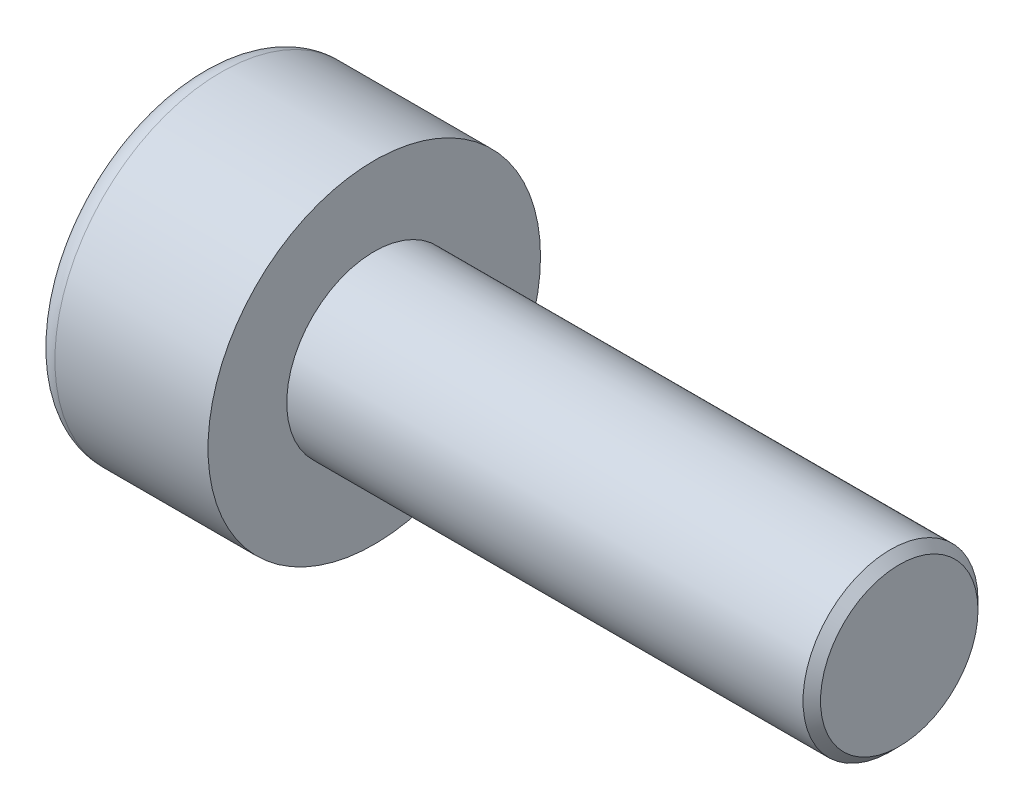
ISO-10303-21;
HEADER;
FILE_DESCRIPTION(('STEP AP214'),'2;1');
FILE_NAME('part.step','',(''),(''),'','','');
FILE_SCHEMA(('AUTOMOTIVE_DESIGN { 1 0 10303 214 1 1 1 1 }'));
ENDSEC;
DATA;
#1=APPLICATION_CONTEXT('core data for automotive mechanical design processes');
#2=APPLICATION_PROTOCOL_DEFINITION('international standard','automotive_design',2000,#1);
#3=PRODUCT_CONTEXT('',#1,'mechanical');
#4=PRODUCT('Part','Part','',(#3));
#5=PRODUCT_RELATED_PRODUCT_CATEGORY('part','',(#4));
#6=PRODUCT_DEFINITION_FORMATION('','',#4);
#7=PRODUCT_DEFINITION_CONTEXT('part definition',#1,'design');
#8=PRODUCT_DEFINITION('design','',#6,#7);
#9=PRODUCT_DEFINITION_SHAPE('','',#8);
#10=(LENGTH_UNIT() NAMED_UNIT(*) SI_UNIT(.MILLI.,.METRE.));
#11=(NAMED_UNIT(*) PLANE_ANGLE_UNIT() SI_UNIT($,.RADIAN.));
#12=(NAMED_UNIT(*) SI_UNIT($,.STERADIAN.) SOLID_ANGLE_UNIT());
#13=UNCERTAINTY_MEASURE_WITH_UNIT(LENGTH_MEASURE(1.E-05),#10,'distance_accuracy_value','');
#14=(GEOMETRIC_REPRESENTATION_CONTEXT(3) GLOBAL_UNCERTAINTY_ASSIGNED_CONTEXT((#13)) GLOBAL_UNIT_ASSIGNED_CONTEXT((#10,
#11,#12)) REPRESENTATION_CONTEXT('',''));
#15=CARTESIAN_POINT('',(0.,0.,0.));
#16=DIRECTION('',(0.,0.,1.));
#17=DIRECTION('',(1.,0.,0.));
#18=AXIS2_PLACEMENT_3D('',#15,#16,#17);
#19=CARTESIAN_POINT('',(1.,0.,-0.866025403784446));
#20=DIRECTION('',(1.,0.,0.));
#21=DIRECTION('',(0.,0.,-1.));
#22=AXIS2_PLACEMENT_3D('',#19,#20,#21);
#23=PLANE('',#22);
#24=DIRECTION('',(0.,0.866025403784434,0.500000000000008));
#25=VECTOR('',#24,1.);
#26=CARTESIAN_POINT('',(1.,0.,-0.866025403784446));
#27=LINE('',#26,#25);
#28=CARTESIAN_POINT('',(1.,0.375000000000005,-0.649519052838325));
#29=VERTEX_POINT('',#28);
#30=CARTESIAN_POINT('',(1.,0.750000000000006,-0.433012701892211));
#31=VERTEX_POINT('',#30);
#32=EDGE_CURVE('E366',#29,#31,#27,.T.);
#33=ORIENTED_EDGE('',*,*,#32,.F.);
#34=CARTESIAN_POINT('',(1.,0.,0.));
#35=DIRECTION('',(1.,0.,0.));
#36=DIRECTION('',(0.,0.,-1.));
#37=AXIS2_PLACEMENT_3D('',#34,#35,#36);
#38=CIRCLE('',#37,0.750000000000004);
#39=CARTESIAN_POINT('',(1.,0.750000000000004,0.));
#40=VERTEX_POINT('',#39);
#41=EDGE_CURVE('E51',#29,#40,#38,.T.);
#42=ORIENTED_EDGE('',*,*,#41,.T.);
#43=DIRECTION('',(0.,0.,1.));
#44=VECTOR('',#43,1.);
#45=CARTESIAN_POINT('',(1.,0.750000000000006,-0.433012701892211));
#46=LINE('',#45,#44);
#47=EDGE_CURVE('E372',#31,#40,#46,.T.);
#48=ORIENTED_EDGE('',*,*,#47,.F.);
#49=EDGE_LOOP('',(#33,#42,#48));
#50=FACE_BOUND('',#49,.T.);
#51=ADVANCED_FACE('F36',(#50),#23,.F.);
#52=CARTESIAN_POINT('',(1.,0.749999999999999,0.433012701892223));
#53=VERTEX_POINT('',#52);
#54=EDGE_CURVE('E371',#40,#53,#46,.T.);
#55=ORIENTED_EDGE('',*,*,#54,.F.);
#56=CARTESIAN_POINT('',(1.,0.374999999999996,0.649519052838336));
#57=VERTEX_POINT('',#56);
#58=EDGE_CURVE('E199',#40,#57,#38,.T.);
#59=ORIENTED_EDGE('',*,*,#58,.T.);
#60=DIRECTION('',(0.,-0.866025403784443,0.499999999999991));
#61=VECTOR('',#60,1.);
#62=CARTESIAN_POINT('',(1.,0.749999999999999,0.433012701892223));
#63=LINE('',#62,#61);
#64=EDGE_CURVE('E375',#53,#57,#63,.T.);
#65=ORIENTED_EDGE('',*,*,#64,.F.);
#66=EDGE_LOOP('',(#55,#59,#65));
#67=FACE_BOUND('',#66,.T.);
#68=ADVANCED_FACE('F125',(#67),#23,.F.);
#69=CARTESIAN_POINT('',(1.,0.,0.866025403784436));
#70=VERTEX_POINT('',#69);
#71=EDGE_CURVE('E374',#57,#70,#63,.T.);
#72=ORIENTED_EDGE('',*,*,#71,.F.);
#73=CARTESIAN_POINT('',(1.,-0.375000000000007,0.64951905283833));
#74=VERTEX_POINT('',#73);
#75=EDGE_CURVE('E386',#57,#74,#38,.T.);
#76=ORIENTED_EDGE('',*,*,#75,.T.);
#77=DIRECTION('',(0.,-0.866025403784435,-0.500000000000006));
#78=VECTOR('',#77,1.);
#79=CARTESIAN_POINT('',(1.,0.,0.866025403784436));
#80=LINE('',#79,#78);
#81=EDGE_CURVE('E325',#70,#74,#80,.T.);
#82=ORIENTED_EDGE('',*,*,#81,.F.);
#83=EDGE_LOOP('',(#72,#76,#82));
#84=FACE_BOUND('',#83,.T.);
#85=ADVANCED_FACE('F130',(#84),#23,.F.);
#86=CARTESIAN_POINT('',(1.,-0.750000000000004,0.433012701892211));
#87=VERTEX_POINT('',#86);
#88=EDGE_CURVE('E377',#74,#87,#80,.T.);
#89=ORIENTED_EDGE('',*,*,#88,.F.);
#90=CARTESIAN_POINT('',(1.,-0.750000000000004,0.));
#91=VERTEX_POINT('',#90);
#92=EDGE_CURVE('E388',#74,#91,#38,.T.);
#93=ORIENTED_EDGE('',*,*,#92,.T.);
#94=DIRECTION('',(0.,0.,-1.));
#95=VECTOR('',#94,1.);
#96=CARTESIAN_POINT('',(1.,-0.750000000000004,0.433012701892211));
#97=LINE('',#96,#95);
#98=EDGE_CURVE('E324',#87,#91,#97,.T.);
#99=ORIENTED_EDGE('',*,*,#98,.F.);
#100=EDGE_LOOP('',(#89,#93,#99));
#101=FACE_BOUND('',#100,.T.);
#102=ADVANCED_FACE('F301',(#101),#23,.F.);
#103=CARTESIAN_POINT('',(1.,-0.75,-0.43301270189222));
#104=VERTEX_POINT('',#103);
#105=EDGE_CURVE('E319',#91,#104,#97,.T.);
#106=ORIENTED_EDGE('',*,*,#105,.F.);
#107=CARTESIAN_POINT('',(1.,-0.375000000000009,-0.649519052838328));
#108=VERTEX_POINT('',#107);
#109=EDGE_CURVE('E190',#91,#108,#38,.T.);
#110=ORIENTED_EDGE('',*,*,#109,.T.);
#111=DIRECTION('',(0.,0.866025403784433,-0.50000000000001));
#112=VECTOR('',#111,1.);
#113=CARTESIAN_POINT('',(1.,-0.75,-0.43301270189222));
#114=LINE('',#113,#112);
#115=EDGE_CURVE('E323',#104,#108,#114,.T.);
#116=ORIENTED_EDGE('',*,*,#115,.F.);
#117=EDGE_LOOP('',(#106,#110,#116));
#118=FACE_BOUND('',#117,.T.);
#119=ADVANCED_FACE('F123',(#118),#23,.F.);
#120=CARTESIAN_POINT('',(0.,0.,0.));
#121=DIRECTION('',(1.,0.,0.));
#122=DIRECTION('',(0.,0.,-1.));
#123=AXIS2_PLACEMENT_3D('',#120,#121,#122);
#124=PLANE('',#123);
#125=CARTESIAN_POINT('',(0.,0.,0.));
#126=DIRECTION('',(1.,0.,0.));
#127=DIRECTION('',(0.,0.,-1.));
#128=AXIS2_PLACEMENT_3D('',#125,#126,#127);
#129=CIRCLE('',#128,1.65);
#130=CARTESIAN_POINT('',(0.,0.,-1.65));
#131=VERTEX_POINT('',#130);
#132=EDGE_CURVE('E198',#131,#131,#129,.F.);
#133=ORIENTED_EDGE('',*,*,#132,.T.);
#134=EDGE_LOOP('',(#133));
#135=FACE_BOUND('',#134,.T.);
#136=DIRECTION('',(0.,0.866025403784433,-0.50000000000001));
#137=VECTOR('',#136,1.);
#138=CARTESIAN_POINT('',(0.,-0.75,-0.43301270189222));
#139=LINE('',#138,#137);
#140=CARTESIAN_POINT('',(0.,-0.75,-0.43301270189222));
#141=VERTEX_POINT('',#140);
#142=CARTESIAN_POINT('',(0.,0.,-0.866025403784446));
#143=VERTEX_POINT('',#142);
#144=EDGE_CURVE('E59',#141,#143,#139,.T.);
#145=ORIENTED_EDGE('',*,*,#144,.T.);
#146=DIRECTION('',(0.,0.866025403784434,0.500000000000008));
#147=VECTOR('',#146,1.);
#148=CARTESIAN_POINT('',(0.,0.,-0.866025403784446));
#149=LINE('',#148,#147);
#150=CARTESIAN_POINT('',(0.,0.750000000000006,-0.433012701892211));
#151=VERTEX_POINT('',#150);
#152=EDGE_CURVE('E339',#143,#151,#149,.T.);
#153=ORIENTED_EDGE('',*,*,#152,.T.);
#154=DIRECTION('',(0.,0.,1.));
#155=VECTOR('',#154,1.);
#156=CARTESIAN_POINT('',(0.,0.750000000000006,-0.433012701892211));
#157=LINE('',#156,#155);
#158=CARTESIAN_POINT('',(0.,0.749999999999999,0.433012701892223));
#159=VERTEX_POINT('',#158);
#160=EDGE_CURVE('E342',#151,#159,#157,.T.);
#161=ORIENTED_EDGE('',*,*,#160,.T.);
#162=DIRECTION('',(0.,-0.866025403784443,0.499999999999991));
#163=VECTOR('',#162,1.);
#164=CARTESIAN_POINT('',(0.,0.749999999999999,0.433012701892223));
#165=LINE('',#164,#163);
#166=CARTESIAN_POINT('',(0.,0.,0.866025403784436));
#167=VERTEX_POINT('',#166);
#168=EDGE_CURVE('E345',#159,#167,#165,.T.);
#169=ORIENTED_EDGE('',*,*,#168,.T.);
#170=DIRECTION('',(0.,-0.866025403784435,-0.500000000000006));
#171=VECTOR('',#170,1.);
#172=CARTESIAN_POINT('',(0.,0.,0.866025403784436));
#173=LINE('',#172,#171);
#174=CARTESIAN_POINT('',(0.,-0.750000000000004,0.433012701892211));
#175=VERTEX_POINT('',#174);
#176=EDGE_CURVE('E348',#167,#175,#173,.T.);
#177=ORIENTED_EDGE('',*,*,#176,.T.);
#178=DIRECTION('',(0.,0.,-1.));
#179=VECTOR('',#178,1.);
#180=CARTESIAN_POINT('',(0.,-0.750000000000004,0.433012701892211));
#181=LINE('',#180,#179);
#182=EDGE_CURVE('E351',#175,#141,#181,.T.);
#183=ORIENTED_EDGE('',*,*,#182,.T.);
#184=EDGE_LOOP('',(#145,#153,#161,#169,#177,#183));
#185=FACE_BOUND('',#184,.T.);
#186=ADVANCED_FACE('F168',(#135,#185),#124,.F.);
#187=CARTESIAN_POINT('',(2.,0.,0.));
#188=DIRECTION('',(1.,0.,0.));
#189=DIRECTION('',(0.,0.,-1.));
#190=AXIS2_PLACEMENT_3D('',#187,#188,#189);
#191=PLANE('',#190);
#192=CARTESIAN_POINT('',(2.,0.,0.));
#193=DIRECTION('',(1.,0.,0.));
#194=DIRECTION('',(0.,0.,-1.));
#195=AXIS2_PLACEMENT_3D('',#192,#193,#194);
#196=CIRCLE('',#195,1.9);
#197=CARTESIAN_POINT('',(2.,0.,-1.9));
#198=VERTEX_POINT('',#197);
#199=EDGE_CURVE('E183',#198,#198,#196,.T.);
#200=ORIENTED_EDGE('',*,*,#199,.T.);
#201=EDGE_LOOP('',(#200));
#202=FACE_BOUND('',#201,.T.);
#203=CARTESIAN_POINT('',(2.,0.,0.));
#204=DIRECTION('',(1.,0.,0.));
#205=DIRECTION('',(0.,0.,-1.));
#206=AXIS2_PLACEMENT_3D('',#203,#204,#205);
#207=CIRCLE('',#206,1.);
#208=CARTESIAN_POINT('',(2.,0.,-1.));
#209=VERTEX_POINT('',#208);
#210=EDGE_CURVE('E186',#209,#209,#207,.T.);
#211=ORIENTED_EDGE('',*,*,#210,.F.);
#212=EDGE_LOOP('',(#211));
#213=FACE_BOUND('',#212,.T.);
#214=ADVANCED_FACE('F165',(#202,#213),#191,.T.);
#215=CARTESIAN_POINT('',(2.,0.,0.));
#216=DIRECTION('',(-1.,0.,0.));
#217=DIRECTION('',(0.,0.,1.));
#218=AXIS2_PLACEMENT_3D('',#215,#216,#217);
#219=CYLINDRICAL_SURFACE('',#218,1.9);
#220=CARTESIAN_POINT('',(0.25,0.,0.));
#221=DIRECTION('',(1.,0.,0.));
#222=DIRECTION('',(0.,0.,-1.));
#223=AXIS2_PLACEMENT_3D('',#220,#221,#222);
#224=CIRCLE('',#223,1.9);
#225=CARTESIAN_POINT('',(0.25,0.,-1.9));
#226=VERTEX_POINT('',#225);
#227=EDGE_CURVE('E180',#226,#226,#224,.T.);
#228=ORIENTED_EDGE('',*,*,#227,.T.);
#229=EDGE_LOOP('',(#228));
#230=FACE_BOUND('',#229,.T.);
#231=ORIENTED_EDGE('',*,*,#199,.F.);
#232=EDGE_LOOP('',(#231));
#233=FACE_BOUND('',#232,.T.);
#234=ADVANCED_FACE('F163',(#230,#233),#219,.T.);
#235=CARTESIAN_POINT('',(8.,0.,0.));
#236=DIRECTION('',(-1.,0.,0.));
#237=DIRECTION('',(0.,0.,1.));
#238=AXIS2_PLACEMENT_3D('',#235,#236,#237);
#239=CYLINDRICAL_SURFACE('',#238,1.);
#240=CARTESIAN_POINT('',(7.9,0.,0.));
#241=DIRECTION('',(1.,0.,0.));
#242=DIRECTION('',(0.,0.,-1.));
#243=AXIS2_PLACEMENT_3D('',#240,#241,#242);
#244=CIRCLE('',#243,1.);
#245=CARTESIAN_POINT('',(7.9,0.,-1.));
#246=VERTEX_POINT('',#245);
#247=EDGE_CURVE('E11',#246,#246,#244,.F.);
#248=ORIENTED_EDGE('',*,*,#247,.T.);
#249=EDGE_LOOP('',(#248));
#250=FACE_BOUND('',#249,.T.);
#251=ORIENTED_EDGE('',*,*,#210,.T.);
#252=EDGE_LOOP('',(#251));
#253=FACE_BOUND('',#252,.T.);
#254=ADVANCED_FACE('F159',(#250,#253),#239,.T.);
#255=CARTESIAN_POINT('',(8.,0.,0.));
#256=DIRECTION('',(1.,0.,0.));
#257=DIRECTION('',(0.,0.,-1.));
#258=AXIS2_PLACEMENT_3D('',#255,#256,#257);
#259=PLANE('',#258);
#260=CARTESIAN_POINT('',(8.,0.,0.));
#261=DIRECTION('',(1.,0.,0.));
#262=DIRECTION('',(0.,0.,-1.));
#263=AXIS2_PLACEMENT_3D('',#260,#261,#262);
#264=CIRCLE('',#263,0.900000000000001);
#265=CARTESIAN_POINT('',(8.,0.,-0.900000000000001));
#266=VERTEX_POINT('',#265);
#267=EDGE_CURVE('E44',#266,#266,#264,.T.);
#268=ORIENTED_EDGE('',*,*,#267,.T.);
#269=EDGE_LOOP('',(#268));
#270=FACE_BOUND('',#269,.T.);
#271=ADVANCED_FACE('F156',(#270),#259,.T.);
#272=CARTESIAN_POINT('',(1.,-0.75,-0.43301270189222));
#273=DIRECTION('',(0.,0.50000000000001,0.866025403784433));
#274=DIRECTION('',(0.,-0.866025403784433,0.50000000000001));
#275=AXIS2_PLACEMENT_3D('',#272,#273,#274);
#276=PLANE('',#275);
#277=ORIENTED_EDGE('',*,*,#144,.F.);
#278=DIRECTION('',(-1.,0.,0.));
#279=VECTOR('',#278,1.);
#280=CARTESIAN_POINT('',(1.,-0.75,-0.43301270189222));
#281=LINE('',#280,#279);
#282=EDGE_CURVE('E333',#104,#141,#281,.T.);
#283=ORIENTED_EDGE('',*,*,#282,.F.);
#284=ORIENTED_EDGE('',*,*,#115,.T.);
#285=CARTESIAN_POINT('',(1.,0.,-0.866025403784446));
#286=VERTEX_POINT('',#285);
#287=EDGE_CURVE('E353',#108,#286,#114,.T.);
#288=ORIENTED_EDGE('',*,*,#287,.T.);
#289=DIRECTION('',(-1.,0.,0.));
#290=VECTOR('',#289,1.);
#291=CARTESIAN_POINT('',(1.,0.,-0.866025403784446));
#292=LINE('',#291,#290);
#293=EDGE_CURVE('E193',#286,#143,#292,.T.);
#294=ORIENTED_EDGE('',*,*,#293,.T.);
#295=EDGE_LOOP('',(#277,#283,#284,#288,#294));
#296=FACE_BOUND('',#295,.T.);
#297=ADVANCED_FACE('F152',(#296),#276,.T.);
#298=CARTESIAN_POINT('',(1.,0.,-0.866025403784446));
#299=DIRECTION('',(0.,-0.500000000000008,0.866025403784434));
#300=DIRECTION('',(0.,-0.866025403784434,-0.500000000000008));
#301=AXIS2_PLACEMENT_3D('',#298,#299,#300);
#302=PLANE('',#301);
#303=ORIENTED_EDGE('',*,*,#152,.F.);
#304=ORIENTED_EDGE('',*,*,#293,.F.);
#305=EDGE_CURVE('E368',#286,#29,#27,.T.);
#306=ORIENTED_EDGE('',*,*,#305,.T.);
#307=ORIENTED_EDGE('',*,*,#32,.T.);
#308=DIRECTION('',(-1.,0.,0.));
#309=VECTOR('',#308,1.);
#310=CARTESIAN_POINT('',(1.,0.750000000000006,-0.433012701892211));
#311=LINE('',#310,#309);
#312=EDGE_CURVE('E360',#31,#151,#311,.T.);
#313=ORIENTED_EDGE('',*,*,#312,.T.);
#314=EDGE_LOOP('',(#303,#304,#306,#307,#313));
#315=FACE_BOUND('',#314,.T.);
#316=ADVANCED_FACE('F148',(#315),#302,.T.);
#317=CARTESIAN_POINT('',(1.,0.750000000000006,-0.433012701892211));
#318=DIRECTION('',(0.,-1.,0.));
#319=DIRECTION('',(0.,0.,-1.));
#320=AXIS2_PLACEMENT_3D('',#317,#318,#319);
#321=PLANE('',#320);
#322=ORIENTED_EDGE('',*,*,#160,.F.);
#323=ORIENTED_EDGE('',*,*,#312,.F.);
#324=ORIENTED_EDGE('',*,*,#47,.T.);
#325=ORIENTED_EDGE('',*,*,#54,.T.);
#326=DIRECTION('',(-1.,0.,0.));
#327=VECTOR('',#326,1.);
#328=CARTESIAN_POINT('',(1.,0.749999999999999,0.433012701892223));
#329=LINE('',#328,#327);
#330=EDGE_CURVE('E358',#53,#159,#329,.T.);
#331=ORIENTED_EDGE('',*,*,#330,.T.);
#332=EDGE_LOOP('',(#322,#323,#324,#325,#331));
#333=FACE_BOUND('',#332,.T.);
#334=ADVANCED_FACE('F144',(#333),#321,.T.);
#335=CARTESIAN_POINT('',(1.,0.749999999999999,0.433012701892223));
#336=DIRECTION('',(0.,-0.499999999999992,-0.866025403784444));
#337=DIRECTION('',(0.,0.866025403784443,-0.499999999999991));
#338=AXIS2_PLACEMENT_3D('',#335,#336,#337);
#339=PLANE('',#338);
#340=ORIENTED_EDGE('',*,*,#168,.F.);
#341=ORIENTED_EDGE('',*,*,#330,.F.);
#342=ORIENTED_EDGE('',*,*,#64,.T.);
#343=ORIENTED_EDGE('',*,*,#71,.T.);
#344=DIRECTION('',(-1.,0.,0.));
#345=VECTOR('',#344,1.);
#346=CARTESIAN_POINT('',(1.,0.,0.866025403784436));
#347=LINE('',#346,#345);
#348=EDGE_CURVE('E356',#70,#167,#347,.T.);
#349=ORIENTED_EDGE('',*,*,#348,.T.);
#350=EDGE_LOOP('',(#340,#341,#342,#343,#349));
#351=FACE_BOUND('',#350,.T.);
#352=ADVANCED_FACE('F140',(#351),#339,.T.);
#353=CARTESIAN_POINT('',(1.,0.,0.866025403784436));
#354=DIRECTION('',(0.,0.500000000000006,-0.866025403784435));
#355=DIRECTION('',(0.,0.866025403784435,0.500000000000006));
#356=AXIS2_PLACEMENT_3D('',#353,#354,#355);
#357=PLANE('',#356);
#358=ORIENTED_EDGE('',*,*,#176,.F.);
#359=ORIENTED_EDGE('',*,*,#348,.F.);
#360=ORIENTED_EDGE('',*,*,#81,.T.);
#361=ORIENTED_EDGE('',*,*,#88,.T.);
#362=DIRECTION('',(-1.,0.,0.));
#363=VECTOR('',#362,1.);
#364=CARTESIAN_POINT('',(1.,-0.750000000000004,0.433012701892211));
#365=LINE('',#364,#363);
#366=EDGE_CURVE('E330',#87,#175,#365,.T.);
#367=ORIENTED_EDGE('',*,*,#366,.T.);
#368=EDGE_LOOP('',(#358,#359,#360,#361,#367));
#369=FACE_BOUND('',#368,.T.);
#370=ADVANCED_FACE('F136',(#369),#357,.T.);
#371=CARTESIAN_POINT('',(1.,-0.750000000000004,0.433012701892211));
#372=DIRECTION('',(0.,1.,0.));
#373=DIRECTION('',(0.,0.,1.));
#374=AXIS2_PLACEMENT_3D('',#371,#372,#373);
#375=PLANE('',#374);
#376=ORIENTED_EDGE('',*,*,#182,.F.);
#377=ORIENTED_EDGE('',*,*,#366,.F.);
#378=ORIENTED_EDGE('',*,*,#98,.T.);
#379=ORIENTED_EDGE('',*,*,#105,.T.);
#380=ORIENTED_EDGE('',*,*,#282,.T.);
#381=EDGE_LOOP('',(#376,#377,#378,#379,#380));
#382=FACE_BOUND('',#381,.T.);
#383=ADVANCED_FACE('F120',(#382),#375,.T.);
#384=ORIENTED_EDGE('',*,*,#287,.F.);
#385=EDGE_CURVE('E185',#108,#29,#38,.T.);
#386=ORIENTED_EDGE('',*,*,#385,.T.);
#387=ORIENTED_EDGE('',*,*,#305,.F.);
#388=EDGE_LOOP('',(#384,#386,#387));
#389=FACE_BOUND('',#388,.T.);
#390=ADVANCED_FACE('F113',(#389),#23,.F.);
#391=CARTESIAN_POINT('',(1.,0.,0.));
#392=DIRECTION('',(-1.,0.,0.));
#393=DIRECTION('',(0.,0.,1.));
#394=AXIS2_PLACEMENT_3D('',#391,#392,#393);
#395=CONICAL_SURFACE('',#394,0.750000000000004,1.04719755119659);
#396=CARTESIAN_POINT('',(1.43301270189223,0.,0.));
#397=VERTEX_POINT('',#396);
#398=VERTEX_LOOP('',#397);
#399=FACE_BOUND('',#398,.T.);
#400=ORIENTED_EDGE('',*,*,#41,.F.);
#401=ORIENTED_EDGE('',*,*,#385,.F.);
#402=ORIENTED_EDGE('',*,*,#109,.F.);
#403=ORIENTED_EDGE('',*,*,#92,.F.);
#404=ORIENTED_EDGE('',*,*,#75,.F.);
#405=ORIENTED_EDGE('',*,*,#58,.F.);
#406=EDGE_LOOP('',(#400,#401,#402,#403,#404,#405));
#407=FACE_BOUND('',#406,.T.);
#408=ADVANCED_FACE('F110',(#399,#407),#395,.F.);
#409=CARTESIAN_POINT('',(0.25,0.,0.));
#410=DIRECTION('',(1.,0.,0.));
#411=DIRECTION('',(0.,0.,-1.));
#412=AXIS2_PLACEMENT_3D('',#409,#410,#411);
#413=TOROIDAL_SURFACE('',#412,1.65,0.25);
#414=ORIENTED_EDGE('',*,*,#132,.F.);
#415=EDGE_LOOP('',(#414));
#416=FACE_BOUND('',#415,.T.);
#417=ORIENTED_EDGE('',*,*,#227,.F.);
#418=EDGE_LOOP('',(#417));
#419=FACE_BOUND('',#418,.T.);
#420=ADVANCED_FACE('F112',(#416,#419),#413,.T.);
#421=CARTESIAN_POINT('',(8.,0.,0.));
#422=DIRECTION('',(-1.,0.,0.));
#423=DIRECTION('',(0.,0.,1.));
#424=AXIS2_PLACEMENT_3D('',#421,#422,#423);
#425=CONICAL_SURFACE('',#424,0.900000000000001,0.785398163397444);
#426=ORIENTED_EDGE('',*,*,#247,.F.);
#427=EDGE_LOOP('',(#426));
#428=FACE_BOUND('',#427,.T.);
#429=ORIENTED_EDGE('',*,*,#267,.F.);
#430=EDGE_LOOP('',(#429));
#431=FACE_BOUND('',#430,.T.);
#432=ADVANCED_FACE('F38',(#428,#431),#425,.T.);
#433=CLOSED_SHELL('',(#51,#68,#85,#102,#119,#186,#214,#234,#254,#271,#297,#316,#334,#352,#370,
#383,#390,#408,#420,#432));
#434=MANIFOLD_SOLID_BREP('B2',#433);
#435=ADVANCED_BREP_SHAPE_REPRESENTATION('',(#18,#434),#14);
#436=SHAPE_DEFINITION_REPRESENTATION(#9,#435);
ENDSEC;
END-ISO-10303-21;
